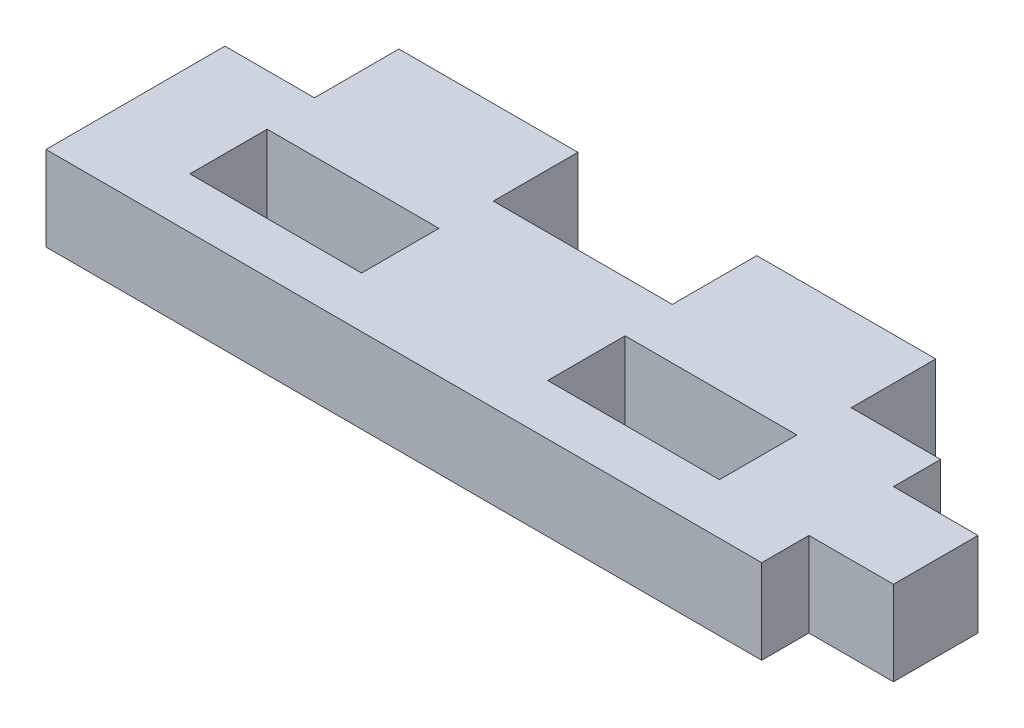
ISO-10303-21;
HEADER;
FILE_DESCRIPTION(('STEP AP214'),'2;1');
FILE_NAME('part.step','',(''),(''),'','','');
FILE_SCHEMA(('AUTOMOTIVE_DESIGN { 1 0 10303 214 1 1 1 1 }'));
ENDSEC;
DATA;
#1=APPLICATION_CONTEXT('core data for automotive mechanical design processes');
#2=APPLICATION_PROTOCOL_DEFINITION('international standard','automotive_design',2000,#1);
#3=PRODUCT_CONTEXT('',#1,'mechanical');
#4=PRODUCT('Part','Part','',(#3));
#5=PRODUCT_RELATED_PRODUCT_CATEGORY('part','',(#4));
#6=PRODUCT_DEFINITION_FORMATION('','',#4);
#7=PRODUCT_DEFINITION_CONTEXT('part definition',#1,'design');
#8=PRODUCT_DEFINITION('design','',#6,#7);
#9=PRODUCT_DEFINITION_SHAPE('','',#8);
#10=(LENGTH_UNIT() NAMED_UNIT(*) SI_UNIT(.MILLI.,.METRE.));
#11=(NAMED_UNIT(*) PLANE_ANGLE_UNIT() SI_UNIT($,.RADIAN.));
#12=(NAMED_UNIT(*) SI_UNIT($,.STERADIAN.) SOLID_ANGLE_UNIT());
#13=UNCERTAINTY_MEASURE_WITH_UNIT(LENGTH_MEASURE(1.E-05),#10,'distance_accuracy_value','');
#14=(GEOMETRIC_REPRESENTATION_CONTEXT(3) GLOBAL_UNCERTAINTY_ASSIGNED_CONTEXT((#13)) GLOBAL_UNIT_ASSIGNED_CONTEXT((#10,
#11,#12)) REPRESENTATION_CONTEXT('',''));
#15=CARTESIAN_POINT('',(0.,0.,0.));
#16=DIRECTION('',(0.,0.,1.));
#17=DIRECTION('',(1.,0.,0.));
#18=AXIS2_PLACEMENT_3D('',#15,#16,#17);
#19=CARTESIAN_POINT('',(0.,1.5,0.));
#20=DIRECTION('',(0.,-1.,0.));
#21=DIRECTION('',(0.,0.,-1.));
#22=AXIS2_PLACEMENT_3D('',#19,#20,#21);
#23=PLANE('',#22);
#24=DIRECTION('',(0.,0.,-1.));
#25=VECTOR('',#24,1.);
#26=CARTESIAN_POINT('',(3.048,1.5,1.372997));
#27=LINE('',#26,#25);
#28=CARTESIAN_POINT('',(3.048,1.5,1.372997));
#29=VERTEX_POINT('',#28);
#30=CARTESIAN_POINT('',(3.048,1.5,-1.372997));
#31=VERTEX_POINT('',#30);
#32=EDGE_CURVE('E257',#29,#31,#27,.T.);
#33=ORIENTED_EDGE('',*,*,#32,.F.);
#34=DIRECTION('',(1.,0.,0.));
#35=VECTOR('',#34,1.);
#36=CARTESIAN_POINT('',(-3.048,1.5,1.372997));
#37=LINE('',#36,#35);
#38=CARTESIAN_POINT('',(-3.048,1.5,1.372997));
#39=VERTEX_POINT('',#38);
#40=EDGE_CURVE('E268',#39,#29,#37,.T.);
#41=ORIENTED_EDGE('',*,*,#40,.F.);
#42=DIRECTION('',(0.,0.,1.));
#43=VECTOR('',#42,1.);
#44=CARTESIAN_POINT('',(-3.048,1.5,1.372997));
#45=LINE('',#44,#43);
#46=CARTESIAN_POINT('',(-3.048,1.5,-1.372997));
#47=VERTEX_POINT('',#46);
#48=EDGE_CURVE('E264',#47,#39,#45,.T.);
#49=ORIENTED_EDGE('',*,*,#48,.F.);
#50=DIRECTION('',(-1.,0.,0.));
#51=VECTOR('',#50,1.);
#52=CARTESIAN_POINT('',(-3.048,1.5,-1.372997));
#53=LINE('',#52,#51);
#54=EDGE_CURVE('E260',#31,#47,#53,.T.);
#55=ORIENTED_EDGE('',*,*,#54,.F.);
#56=EDGE_LOOP('',(#33,#41,#49,#55));
#57=FACE_BOUND('',#56,.T.);
#58=DIRECTION('',(0.,0.,-1.));
#59=VECTOR('',#58,1.);
#60=CARTESIAN_POINT('',(6.35,1.5,-1.5));
#61=LINE('',#60,#59);
#62=CARTESIAN_POINT('',(6.35,1.5,-1.5));
#63=VERTEX_POINT('',#62);
#64=CARTESIAN_POINT('',(6.35,1.5,-3.175));
#65=VERTEX_POINT('',#64);
#66=EDGE_CURVE('E300',#63,#65,#61,.T.);
#67=ORIENTED_EDGE('',*,*,#66,.T.);
#68=DIRECTION('',(-1.,0.,0.));
#69=VECTOR('',#68,1.);
#70=CARTESIAN_POINT('',(3.175,1.5,-3.175));
#71=LINE('',#70,#69);
#72=CARTESIAN_POINT('',(3.175,1.5,-3.175));
#73=VERTEX_POINT('',#72);
#74=EDGE_CURVE('E304',#65,#73,#71,.T.);
#75=ORIENTED_EDGE('',*,*,#74,.T.);
#76=DIRECTION('',(0.,0.,-1.));
#77=VECTOR('',#76,1.);
#78=CARTESIAN_POINT('',(3.175,1.5,-6.175));
#79=LINE('',#78,#77);
#80=CARTESIAN_POINT('',(3.175,1.5,-6.175));
#81=VERTEX_POINT('',#80);
#82=EDGE_CURVE('E308',#73,#81,#79,.T.);
#83=ORIENTED_EDGE('',*,*,#82,.T.);
#84=DIRECTION('',(-1.,0.,0.));
#85=VECTOR('',#84,1.);
#86=CARTESIAN_POINT('',(-3.175,1.5,-6.175));
#87=LINE('',#86,#85);
#88=CARTESIAN_POINT('',(-3.175,1.5,-6.175));
#89=VERTEX_POINT('',#88);
#90=EDGE_CURVE('E311',#81,#89,#87,.T.);
#91=ORIENTED_EDGE('',*,*,#90,.T.);
#92=DIRECTION('',(0.,0.,1.));
#93=VECTOR('',#92,1.);
#94=CARTESIAN_POINT('',(-3.175,1.5,-6.175));
#95=LINE('',#94,#93);
#96=CARTESIAN_POINT('',(-3.175,1.5,-3.175));
#97=VERTEX_POINT('',#96);
#98=EDGE_CURVE('E314',#89,#97,#95,.T.);
#99=ORIENTED_EDGE('',*,*,#98,.T.);
#100=DIRECTION('',(-1.,0.,0.));
#101=VECTOR('',#100,1.);
#102=CARTESIAN_POINT('',(-6.35,1.5,-3.175));
#103=LINE('',#102,#101);
#104=CARTESIAN_POINT('',(-9.525,1.5,-3.175));
#105=VERTEX_POINT('',#104);
#106=EDGE_CURVE('E317',#97,#105,#103,.T.);
#107=ORIENTED_EDGE('',*,*,#106,.T.);
#108=DIRECTION('',(0.,0.,-1.));
#109=VECTOR('',#108,1.);
#110=CARTESIAN_POINT('',(-9.525,1.5,-6.175));
#111=LINE('',#110,#109);
#112=CARTESIAN_POINT('',(-9.525,1.5,-6.175));
#113=VERTEX_POINT('',#112);
#114=EDGE_CURVE('E320',#105,#113,#111,.T.);
#115=ORIENTED_EDGE('',*,*,#114,.T.);
#116=DIRECTION('',(-1.,0.,0.));
#117=VECTOR('',#116,1.);
#118=CARTESIAN_POINT('',(-15.875,1.5,-6.175));
#119=LINE('',#118,#117);
#120=CARTESIAN_POINT('',(-15.875,1.5,-6.175));
#121=VERTEX_POINT('',#120);
#122=EDGE_CURVE('E323',#113,#121,#119,.T.);
#123=ORIENTED_EDGE('',*,*,#122,.T.);
#124=DIRECTION('',(0.,0.,1.));
#125=VECTOR('',#124,1.);
#126=CARTESIAN_POINT('',(-15.875,1.5,-6.175));
#127=LINE('',#126,#125);
#128=CARTESIAN_POINT('',(-15.875,1.5,-3.175));
#129=VERTEX_POINT('',#128);
#130=EDGE_CURVE('E326',#121,#129,#127,.T.);
#131=ORIENTED_EDGE('',*,*,#130,.T.);
#132=DIRECTION('',(-1.,0.,0.));
#133=VECTOR('',#132,1.);
#134=CARTESIAN_POINT('',(-19.05,1.5,-3.175));
#135=LINE('',#134,#133);
#136=CARTESIAN_POINT('',(-19.05,1.5,-3.175));
#137=VERTEX_POINT('',#136);
#138=EDGE_CURVE('E329',#129,#137,#135,.T.);
#139=ORIENTED_EDGE('',*,*,#138,.T.);
#140=DIRECTION('',(0.,0.,1.));
#141=VECTOR('',#140,1.);
#142=CARTESIAN_POINT('',(-19.05,1.5,3.175));
#143=LINE('',#142,#141);
#144=CARTESIAN_POINT('',(-19.05,1.5,3.175));
#145=VERTEX_POINT('',#144);
#146=EDGE_CURVE('E332',#137,#145,#143,.T.);
#147=ORIENTED_EDGE('',*,*,#146,.T.);
#148=DIRECTION('',(1.,0.,0.));
#149=VECTOR('',#148,1.);
#150=CARTESIAN_POINT('',(-19.05,1.5,3.175));
#151=LINE('',#150,#149);
#152=CARTESIAN_POINT('',(6.35,1.5,3.175));
#153=VERTEX_POINT('',#152);
#154=EDGE_CURVE('E335',#145,#153,#151,.T.);
#155=ORIENTED_EDGE('',*,*,#154,.T.);
#156=DIRECTION('',(0.,0.,-1.));
#157=VECTOR('',#156,1.);
#158=CARTESIAN_POINT('',(6.35,1.5,3.175));
#159=LINE('',#158,#157);
#160=CARTESIAN_POINT('',(6.35,1.5,1.5));
#161=VERTEX_POINT('',#160);
#162=EDGE_CURVE('E338',#153,#161,#159,.T.);
#163=ORIENTED_EDGE('',*,*,#162,.T.);
#164=DIRECTION('',(1.,0.,0.));
#165=VECTOR('',#164,1.);
#166=CARTESIAN_POINT('',(9.35,1.5,1.5));
#167=LINE('',#166,#165);
#168=CARTESIAN_POINT('',(9.35,1.5,1.5));
#169=VERTEX_POINT('',#168);
#170=EDGE_CURVE('E341',#161,#169,#167,.T.);
#171=ORIENTED_EDGE('',*,*,#170,.T.);
#172=DIRECTION('',(0.,0.,-1.));
#173=VECTOR('',#172,1.);
#174=CARTESIAN_POINT('',(9.35,1.5,1.5));
#175=LINE('',#174,#173);
#176=CARTESIAN_POINT('',(9.35,1.5,-1.5));
#177=VERTEX_POINT('',#176);
#178=EDGE_CURVE('E344',#169,#177,#175,.T.);
#179=ORIENTED_EDGE('',*,*,#178,.T.);
#180=DIRECTION('',(-1.,0.,0.));
#181=VECTOR('',#180,1.);
#182=CARTESIAN_POINT('',(9.35,1.5,-1.5));
#183=LINE('',#182,#181);
#184=EDGE_CURVE('E347',#177,#63,#183,.T.);
#185=ORIENTED_EDGE('',*,*,#184,.T.);
#186=EDGE_LOOP('',(#67,#75,#83,#91,#99,#107,#115,#123,#131,#139,#147,#155,#163,#171,#179,#185));
#187=FACE_BOUND('',#186,.T.);
#188=DIRECTION('',(0.,0.,-1.));
#189=VECTOR('',#188,1.);
#190=CARTESIAN_POINT('',(-9.652,1.5,-1.372997));
#191=LINE('',#190,#189);
#192=CARTESIAN_POINT('',(-9.652,1.5,1.372997));
#193=VERTEX_POINT('',#192);
#194=CARTESIAN_POINT('',(-9.652,1.5,-1.372997));
#195=VERTEX_POINT('',#194);
#196=EDGE_CURVE('E209',#193,#195,#191,.T.);
#197=ORIENTED_EDGE('',*,*,#196,.F.);
#198=DIRECTION('',(1.,0.,0.));
#199=VECTOR('',#198,1.);
#200=CARTESIAN_POINT('',(-15.748,1.5,1.372997));
#201=LINE('',#200,#199);
#202=CARTESIAN_POINT('',(-15.748,1.5,1.372997));
#203=VERTEX_POINT('',#202);
#204=EDGE_CURVE('E235',#203,#193,#201,.T.);
#205=ORIENTED_EDGE('',*,*,#204,.F.);
#206=DIRECTION('',(0.,0.,1.));
#207=VECTOR('',#206,1.);
#208=CARTESIAN_POINT('',(-15.748,1.5,-1.372997));
#209=LINE('',#208,#207);
#210=CARTESIAN_POINT('',(-15.748,1.5,-1.372997));
#211=VERTEX_POINT('',#210);
#212=EDGE_CURVE('E231',#211,#203,#209,.T.);
#213=ORIENTED_EDGE('',*,*,#212,.F.);
#214=DIRECTION('',(-1.,0.,0.));
#215=VECTOR('',#214,1.);
#216=CARTESIAN_POINT('',(-15.748,1.5,-1.372997));
#217=LINE('',#216,#215);
#218=EDGE_CURVE('E218',#195,#211,#217,.T.);
#219=ORIENTED_EDGE('',*,*,#218,.F.);
#220=EDGE_LOOP('',(#197,#205,#213,#219));
#221=FACE_BOUND('',#220,.T.);
#222=ADVANCED_FACE('F47',(#57,#187,#221),#23,.F.);
#223=CARTESIAN_POINT('',(0.,-1.5,0.));
#224=DIRECTION('',(0.,-1.,0.));
#225=DIRECTION('',(0.,0.,-1.));
#226=AXIS2_PLACEMENT_3D('',#223,#224,#225);
#227=PLANE('',#226);
#228=DIRECTION('',(0.,0.,-1.));
#229=VECTOR('',#228,1.);
#230=CARTESIAN_POINT('',(6.35,-1.5,-1.5));
#231=LINE('',#230,#229);
#232=CARTESIAN_POINT('',(6.35,-1.5,-1.5));
#233=VERTEX_POINT('',#232);
#234=CARTESIAN_POINT('',(6.35,-1.5,-3.175));
#235=VERTEX_POINT('',#234);
#236=EDGE_CURVE('E299',#233,#235,#231,.T.);
#237=ORIENTED_EDGE('',*,*,#236,.F.);
#238=DIRECTION('',(-1.,0.,0.));
#239=VECTOR('',#238,1.);
#240=CARTESIAN_POINT('',(9.35,-1.5,-1.5));
#241=LINE('',#240,#239);
#242=CARTESIAN_POINT('',(9.35,-1.5,-1.5));
#243=VERTEX_POINT('',#242);
#244=EDGE_CURVE('E305',#243,#233,#241,.T.);
#245=ORIENTED_EDGE('',*,*,#244,.F.);
#246=DIRECTION('',(0.,0.,-1.));
#247=VECTOR('',#246,1.);
#248=CARTESIAN_POINT('',(9.35,-1.5,1.5));
#249=LINE('',#248,#247);
#250=CARTESIAN_POINT('',(9.35,-1.5,1.5));
#251=VERTEX_POINT('',#250);
#252=EDGE_CURVE('E395',#251,#243,#249,.T.);
#253=ORIENTED_EDGE('',*,*,#252,.F.);
#254=DIRECTION('',(1.,0.,0.));
#255=VECTOR('',#254,1.);
#256=CARTESIAN_POINT('',(9.35,-1.5,1.5));
#257=LINE('',#256,#255);
#258=CARTESIAN_POINT('',(6.35,-1.5,1.5));
#259=VERTEX_POINT('',#258);
#260=EDGE_CURVE('E392',#259,#251,#257,.T.);
#261=ORIENTED_EDGE('',*,*,#260,.F.);
#262=DIRECTION('',(0.,0.,-1.));
#263=VECTOR('',#262,1.);
#264=CARTESIAN_POINT('',(6.35,-1.5,3.175));
#265=LINE('',#264,#263);
#266=CARTESIAN_POINT('',(6.35,-1.5,3.175));
#267=VERTEX_POINT('',#266);
#268=EDGE_CURVE('E389',#267,#259,#265,.T.);
#269=ORIENTED_EDGE('',*,*,#268,.F.);
#270=DIRECTION('',(1.,0.,0.));
#271=VECTOR('',#270,1.);
#272=CARTESIAN_POINT('',(-6.35,-1.5,3.175));
#273=LINE('',#272,#271);
#274=CARTESIAN_POINT('',(-19.05,-1.5,3.175));
#275=VERTEX_POINT('',#274);
#276=EDGE_CURVE('E386',#275,#267,#273,.T.);
#277=ORIENTED_EDGE('',*,*,#276,.F.);
#278=DIRECTION('',(0.,0.,1.));
#279=VECTOR('',#278,1.);
#280=CARTESIAN_POINT('',(-19.05,-1.5,3.175));
#281=LINE('',#280,#279);
#282=CARTESIAN_POINT('',(-19.05,-1.5,-3.175));
#283=VERTEX_POINT('',#282);
#284=EDGE_CURVE('E382',#283,#275,#281,.T.);
#285=ORIENTED_EDGE('',*,*,#284,.F.);
#286=DIRECTION('',(-1.,0.,0.));
#287=VECTOR('',#286,1.);
#288=CARTESIAN_POINT('',(-19.05,-1.5,-3.175));
#289=LINE('',#288,#287);
#290=CARTESIAN_POINT('',(-15.875,-1.5,-3.175));
#291=VERTEX_POINT('',#290);
#292=EDGE_CURVE('E379',#291,#283,#289,.T.);
#293=ORIENTED_EDGE('',*,*,#292,.F.);
#294=DIRECTION('',(0.,0.,1.));
#295=VECTOR('',#294,1.);
#296=CARTESIAN_POINT('',(-15.875,-1.5,-6.175));
#297=LINE('',#296,#295);
#298=CARTESIAN_POINT('',(-15.875,-1.5,-6.175));
#299=VERTEX_POINT('',#298);
#300=EDGE_CURVE('E376',#299,#291,#297,.T.);
#301=ORIENTED_EDGE('',*,*,#300,.F.);
#302=DIRECTION('',(-1.,0.,0.));
#303=VECTOR('',#302,1.);
#304=CARTESIAN_POINT('',(-15.875,-1.5,-6.175));
#305=LINE('',#304,#303);
#306=CARTESIAN_POINT('',(-9.525,-1.5,-6.175));
#307=VERTEX_POINT('',#306);
#308=EDGE_CURVE('E373',#307,#299,#305,.T.);
#309=ORIENTED_EDGE('',*,*,#308,.F.);
#310=DIRECTION('',(0.,0.,-1.));
#311=VECTOR('',#310,1.);
#312=CARTESIAN_POINT('',(-9.525,-1.5,-6.175));
#313=LINE('',#312,#311);
#314=CARTESIAN_POINT('',(-9.525,-1.5,-3.175));
#315=VERTEX_POINT('',#314);
#316=EDGE_CURVE('E370',#315,#307,#313,.T.);
#317=ORIENTED_EDGE('',*,*,#316,.F.);
#318=DIRECTION('',(-1.,0.,0.));
#319=VECTOR('',#318,1.);
#320=CARTESIAN_POINT('',(-9.525,-1.5,-3.175));
#321=LINE('',#320,#319);
#322=CARTESIAN_POINT('',(-3.175,-1.5,-3.175));
#323=VERTEX_POINT('',#322);
#324=EDGE_CURVE('E367',#323,#315,#321,.T.);
#325=ORIENTED_EDGE('',*,*,#324,.F.);
#326=DIRECTION('',(0.,0.,1.));
#327=VECTOR('',#326,1.);
#328=CARTESIAN_POINT('',(-3.175,-1.5,-6.175));
#329=LINE('',#328,#327);
#330=CARTESIAN_POINT('',(-3.175,-1.5,-6.175));
#331=VERTEX_POINT('',#330);
#332=EDGE_CURVE('E363',#331,#323,#329,.T.);
#333=ORIENTED_EDGE('',*,*,#332,.F.);
#334=DIRECTION('',(-1.,0.,0.));
#335=VECTOR('',#334,1.);
#336=CARTESIAN_POINT('',(-3.175,-1.5,-6.175));
#337=LINE('',#336,#335);
#338=CARTESIAN_POINT('',(3.175,-1.5,-6.175));
#339=VERTEX_POINT('',#338);
#340=EDGE_CURVE('E360',#339,#331,#337,.T.);
#341=ORIENTED_EDGE('',*,*,#340,.F.);
#342=DIRECTION('',(0.,0.,-1.));
#343=VECTOR('',#342,1.);
#344=CARTESIAN_POINT('',(3.175,-1.5,-6.175));
#345=LINE('',#344,#343);
#346=CARTESIAN_POINT('',(3.175,-1.5,-3.175));
#347=VERTEX_POINT('',#346);
#348=EDGE_CURVE('E357',#347,#339,#345,.T.);
#349=ORIENTED_EDGE('',*,*,#348,.F.);
#350=DIRECTION('',(-1.,0.,0.));
#351=VECTOR('',#350,1.);
#352=CARTESIAN_POINT('',(3.175,-1.5,-3.175));
#353=LINE('',#352,#351);
#354=EDGE_CURVE('E354',#235,#347,#353,.T.);
#355=ORIENTED_EDGE('',*,*,#354,.F.);
#356=EDGE_LOOP('',(#237,#245,#253,#261,#269,#277,#285,#293,#301,#309,#317,#325,#333,#341,#349,#355));
#357=FACE_BOUND('',#356,.T.);
#358=DIRECTION('',(1.,0.,0.));
#359=VECTOR('',#358,1.);
#360=CARTESIAN_POINT('',(-3.048,-1.5,1.372997));
#361=LINE('',#360,#359);
#362=CARTESIAN_POINT('',(-3.048,-1.5,1.372997));
#363=VERTEX_POINT('',#362);
#364=CARTESIAN_POINT('',(3.048,-1.5,1.372997));
#365=VERTEX_POINT('',#364);
#366=EDGE_CURVE('E261',#363,#365,#361,.T.);
#367=ORIENTED_EDGE('',*,*,#366,.T.);
#368=DIRECTION('',(0.,0.,-1.));
#369=VECTOR('',#368,1.);
#370=CARTESIAN_POINT('',(3.048,-1.5,1.372997));
#371=LINE('',#370,#369);
#372=CARTESIAN_POINT('',(3.048,-1.5,-1.372997));
#373=VERTEX_POINT('',#372);
#374=EDGE_CURVE('E227',#365,#373,#371,.T.);
#375=ORIENTED_EDGE('',*,*,#374,.T.);
#376=DIRECTION('',(-1.,0.,0.));
#377=VECTOR('',#376,1.);
#378=CARTESIAN_POINT('',(-3.048,-1.5,-1.372997));
#379=LINE('',#378,#377);
#380=CARTESIAN_POINT('',(-3.048,-1.5,-1.372997));
#381=VERTEX_POINT('',#380);
#382=EDGE_CURVE('E275',#373,#381,#379,.T.);
#383=ORIENTED_EDGE('',*,*,#382,.T.);
#384=DIRECTION('',(0.,0.,1.));
#385=VECTOR('',#384,1.);
#386=CARTESIAN_POINT('',(-3.048,-1.5,1.372997));
#387=LINE('',#386,#385);
#388=EDGE_CURVE('E279',#381,#363,#387,.T.);
#389=ORIENTED_EDGE('',*,*,#388,.T.);
#390=EDGE_LOOP('',(#367,#375,#383,#389));
#391=FACE_BOUND('',#390,.T.);
#392=DIRECTION('',(1.,0.,0.));
#393=VECTOR('',#392,1.);
#394=CARTESIAN_POINT('',(-15.748,-1.5,1.372997));
#395=LINE('',#394,#393);
#396=CARTESIAN_POINT('',(-15.748,-1.5,1.372997));
#397=VERTEX_POINT('',#396);
#398=CARTESIAN_POINT('',(-9.652,-1.5,1.372997));
#399=VERTEX_POINT('',#398);
#400=EDGE_CURVE('E219',#397,#399,#395,.T.);
#401=ORIENTED_EDGE('',*,*,#400,.T.);
#402=DIRECTION('',(0.,0.,-1.));
#403=VECTOR('',#402,1.);
#404=CARTESIAN_POINT('',(-9.652,-1.5,-1.372997));
#405=LINE('',#404,#403);
#406=CARTESIAN_POINT('',(-9.652,-1.5,-1.372997));
#407=VERTEX_POINT('',#406);
#408=EDGE_CURVE('E71',#399,#407,#405,.T.);
#409=ORIENTED_EDGE('',*,*,#408,.T.);
#410=DIRECTION('',(-1.,0.,0.));
#411=VECTOR('',#410,1.);
#412=CARTESIAN_POINT('',(-15.748,-1.5,-1.372997));
#413=LINE('',#412,#411);
#414=CARTESIAN_POINT('',(-15.748,-1.5,-1.372997));
#415=VERTEX_POINT('',#414);
#416=EDGE_CURVE('E225',#407,#415,#413,.T.);
#417=ORIENTED_EDGE('',*,*,#416,.T.);
#418=DIRECTION('',(0.,0.,1.));
#419=VECTOR('',#418,1.);
#420=CARTESIAN_POINT('',(-15.748,-1.5,-1.372997));
#421=LINE('',#420,#419);
#422=EDGE_CURVE('E244',#415,#397,#421,.T.);
#423=ORIENTED_EDGE('',*,*,#422,.T.);
#424=EDGE_LOOP('',(#401,#409,#417,#423));
#425=FACE_BOUND('',#424,.T.);
#426=ADVANCED_FACE('F466',(#357,#391,#425),#227,.T.);
#427=CARTESIAN_POINT('',(6.35,1.5,-1.5));
#428=DIRECTION('',(-1.,0.,0.));
#429=DIRECTION('',(0.,0.,1.));
#430=AXIS2_PLACEMENT_3D('',#427,#428,#429);
#431=PLANE('',#430);
#432=ORIENTED_EDGE('',*,*,#236,.T.);
#433=DIRECTION('',(0.,-1.,0.));
#434=VECTOR('',#433,1.);
#435=CARTESIAN_POINT('',(6.35,1.5,-3.175));
#436=LINE('',#435,#434);
#437=EDGE_CURVE('E11',#65,#235,#436,.T.);
#438=ORIENTED_EDGE('',*,*,#437,.F.);
#439=ORIENTED_EDGE('',*,*,#66,.F.);
#440=DIRECTION('',(0.,-1.,0.));
#441=VECTOR('',#440,1.);
#442=CARTESIAN_POINT('',(6.35,1.5,-1.5));
#443=LINE('',#442,#441);
#444=EDGE_CURVE('E350',#63,#233,#443,.T.);
#445=ORIENTED_EDGE('',*,*,#444,.T.);
#446=EDGE_LOOP('',(#432,#438,#439,#445));
#447=FACE_BOUND('',#446,.T.);
#448=ADVANCED_FACE('F49',(#447),#431,.F.);
#449=CARTESIAN_POINT('',(3.175,1.5,-3.175));
#450=DIRECTION('',(0.,0.,1.));
#451=DIRECTION('',(1.,0.,0.));
#452=AXIS2_PLACEMENT_3D('',#449,#450,#451);
#453=PLANE('',#452);
#454=ORIENTED_EDGE('',*,*,#354,.T.);
#455=DIRECTION('',(0.,-1.,0.));
#456=VECTOR('',#455,1.);
#457=CARTESIAN_POINT('',(3.175,1.5,-3.175));
#458=LINE('',#457,#456);
#459=EDGE_CURVE('E56',#73,#347,#458,.T.);
#460=ORIENTED_EDGE('',*,*,#459,.F.);
#461=ORIENTED_EDGE('',*,*,#74,.F.);
#462=ORIENTED_EDGE('',*,*,#437,.T.);
#463=EDGE_LOOP('',(#454,#460,#461,#462));
#464=FACE_BOUND('',#463,.T.);
#465=ADVANCED_FACE('F482',(#464),#453,.F.);
#466=CARTESIAN_POINT('',(3.175,1.5,-6.175));
#467=DIRECTION('',(-1.,0.,0.));
#468=DIRECTION('',(0.,0.,1.));
#469=AXIS2_PLACEMENT_3D('',#466,#467,#468);
#470=PLANE('',#469);
#471=ORIENTED_EDGE('',*,*,#348,.T.);
#472=DIRECTION('',(0.,-1.,0.));
#473=VECTOR('',#472,1.);
#474=CARTESIAN_POINT('',(3.175,1.5,-6.175));
#475=LINE('',#474,#473);
#476=EDGE_CURVE('E451',#81,#339,#475,.T.);
#477=ORIENTED_EDGE('',*,*,#476,.F.);
#478=ORIENTED_EDGE('',*,*,#82,.F.);
#479=ORIENTED_EDGE('',*,*,#459,.T.);
#480=EDGE_LOOP('',(#471,#477,#478,#479));
#481=FACE_BOUND('',#480,.T.);
#482=ADVANCED_FACE('F460',(#481),#470,.F.);
#483=CARTESIAN_POINT('',(-3.175,1.5,-6.175));
#484=DIRECTION('',(0.,0.,1.));
#485=DIRECTION('',(1.,0.,0.));
#486=AXIS2_PLACEMENT_3D('',#483,#484,#485);
#487=PLANE('',#486);
#488=ORIENTED_EDGE('',*,*,#340,.T.);
#489=DIRECTION('',(0.,-1.,0.));
#490=VECTOR('',#489,1.);
#491=CARTESIAN_POINT('',(-3.175,1.5,-6.175));
#492=LINE('',#491,#490);
#493=EDGE_CURVE('E447',#89,#331,#492,.T.);
#494=ORIENTED_EDGE('',*,*,#493,.F.);
#495=ORIENTED_EDGE('',*,*,#90,.F.);
#496=ORIENTED_EDGE('',*,*,#476,.T.);
#497=EDGE_LOOP('',(#488,#494,#495,#496));
#498=FACE_BOUND('',#497,.T.);
#499=ADVANCED_FACE('F471',(#498),#487,.F.);
#500=CARTESIAN_POINT('',(-3.175,1.5,-6.175));
#501=DIRECTION('',(1.,0.,0.));
#502=DIRECTION('',(0.,0.,-1.));
#503=AXIS2_PLACEMENT_3D('',#500,#501,#502);
#504=PLANE('',#503);
#505=ORIENTED_EDGE('',*,*,#332,.T.);
#506=DIRECTION('',(0.,-1.,0.));
#507=VECTOR('',#506,1.);
#508=CARTESIAN_POINT('',(-3.175,1.5,-3.175));
#509=LINE('',#508,#507);
#510=EDGE_CURVE('E443',#97,#323,#509,.T.);
#511=ORIENTED_EDGE('',*,*,#510,.F.);
#512=ORIENTED_EDGE('',*,*,#98,.F.);
#513=ORIENTED_EDGE('',*,*,#493,.T.);
#514=EDGE_LOOP('',(#505,#511,#512,#513));
#515=FACE_BOUND('',#514,.T.);
#516=ADVANCED_FACE('F475',(#515),#504,.F.);
#517=CARTESIAN_POINT('',(-9.525,1.5,-3.175));
#518=DIRECTION('',(0.,0.,1.));
#519=DIRECTION('',(1.,0.,0.));
#520=AXIS2_PLACEMENT_3D('',#517,#518,#519);
#521=PLANE('',#520);
#522=ORIENTED_EDGE('',*,*,#324,.T.);
#523=DIRECTION('',(0.,-1.,0.));
#524=VECTOR('',#523,1.);
#525=CARTESIAN_POINT('',(-9.525,1.5,-3.175));
#526=LINE('',#525,#524);
#527=EDGE_CURVE('E439',#105,#315,#526,.T.);
#528=ORIENTED_EDGE('',*,*,#527,.F.);
#529=ORIENTED_EDGE('',*,*,#106,.F.);
#530=ORIENTED_EDGE('',*,*,#510,.T.);
#531=EDGE_LOOP('',(#522,#528,#529,#530));
#532=FACE_BOUND('',#531,.T.);
#533=ADVANCED_FACE('F534',(#532),#521,.F.);
#534=CARTESIAN_POINT('',(-9.525,1.5,-6.175));
#535=DIRECTION('',(-1.,0.,0.));
#536=DIRECTION('',(0.,0.,1.));
#537=AXIS2_PLACEMENT_3D('',#534,#535,#536);
#538=PLANE('',#537);
#539=ORIENTED_EDGE('',*,*,#316,.T.);
#540=DIRECTION('',(0.,-1.,0.));
#541=VECTOR('',#540,1.);
#542=CARTESIAN_POINT('',(-9.525,1.5,-6.175));
#543=LINE('',#542,#541);
#544=EDGE_CURVE('E435',#113,#307,#543,.T.);
#545=ORIENTED_EDGE('',*,*,#544,.F.);
#546=ORIENTED_EDGE('',*,*,#114,.F.);
#547=ORIENTED_EDGE('',*,*,#527,.T.);
#548=EDGE_LOOP('',(#539,#545,#546,#547));
#549=FACE_BOUND('',#548,.T.);
#550=ADVANCED_FACE('F531',(#549),#538,.F.);
#551=CARTESIAN_POINT('',(-15.875,1.5,-6.175));
#552=DIRECTION('',(0.,0.,1.));
#553=DIRECTION('',(1.,0.,0.));
#554=AXIS2_PLACEMENT_3D('',#551,#552,#553);
#555=PLANE('',#554);
#556=ORIENTED_EDGE('',*,*,#308,.T.);
#557=DIRECTION('',(0.,-1.,0.));
#558=VECTOR('',#557,1.);
#559=CARTESIAN_POINT('',(-15.875,1.5,-6.175));
#560=LINE('',#559,#558);
#561=EDGE_CURVE('E431',#121,#299,#560,.T.);
#562=ORIENTED_EDGE('',*,*,#561,.F.);
#563=ORIENTED_EDGE('',*,*,#122,.F.);
#564=ORIENTED_EDGE('',*,*,#544,.T.);
#565=EDGE_LOOP('',(#556,#562,#563,#564));
#566=FACE_BOUND('',#565,.T.);
#567=ADVANCED_FACE('F527',(#566),#555,.F.);
#568=CARTESIAN_POINT('',(-15.875,1.5,-6.175));
#569=DIRECTION('',(1.,0.,0.));
#570=DIRECTION('',(0.,0.,-1.));
#571=AXIS2_PLACEMENT_3D('',#568,#569,#570);
#572=PLANE('',#571);
#573=ORIENTED_EDGE('',*,*,#300,.T.);
#574=DIRECTION('',(0.,-1.,0.));
#575=VECTOR('',#574,1.);
#576=CARTESIAN_POINT('',(-15.875,1.5,-3.175));
#577=LINE('',#576,#575);
#578=EDGE_CURVE('E427',#129,#291,#577,.T.);
#579=ORIENTED_EDGE('',*,*,#578,.F.);
#580=ORIENTED_EDGE('',*,*,#130,.F.);
#581=ORIENTED_EDGE('',*,*,#561,.T.);
#582=EDGE_LOOP('',(#573,#579,#580,#581));
#583=FACE_BOUND('',#582,.T.);
#584=ADVANCED_FACE('F523',(#583),#572,.F.);
#585=CARTESIAN_POINT('',(-19.05,1.5,-3.175));
#586=DIRECTION('',(0.,0.,1.));
#587=DIRECTION('',(1.,0.,0.));
#588=AXIS2_PLACEMENT_3D('',#585,#586,#587);
#589=PLANE('',#588);
#590=ORIENTED_EDGE('',*,*,#292,.T.);
#591=DIRECTION('',(0.,-1.,0.));
#592=VECTOR('',#591,1.);
#593=CARTESIAN_POINT('',(-19.05,1.5,-3.175));
#594=LINE('',#593,#592);
#595=EDGE_CURVE('E423',#137,#283,#594,.T.);
#596=ORIENTED_EDGE('',*,*,#595,.F.);
#597=ORIENTED_EDGE('',*,*,#138,.F.);
#598=ORIENTED_EDGE('',*,*,#578,.T.);
#599=EDGE_LOOP('',(#590,#596,#597,#598));
#600=FACE_BOUND('',#599,.T.);
#601=ADVANCED_FACE('F518',(#600),#589,.F.);
#602=CARTESIAN_POINT('',(-19.05,1.5,3.175));
#603=DIRECTION('',(1.,0.,0.));
#604=DIRECTION('',(0.,0.,-1.));
#605=AXIS2_PLACEMENT_3D('',#602,#603,#604);
#606=PLANE('',#605);
#607=ORIENTED_EDGE('',*,*,#284,.T.);
#608=DIRECTION('',(0.,-1.,0.));
#609=VECTOR('',#608,1.);
#610=CARTESIAN_POINT('',(-19.05,1.5,3.175));
#611=LINE('',#610,#609);
#612=EDGE_CURVE('E419',#145,#275,#611,.T.);
#613=ORIENTED_EDGE('',*,*,#612,.F.);
#614=ORIENTED_EDGE('',*,*,#146,.F.);
#615=ORIENTED_EDGE('',*,*,#595,.T.);
#616=EDGE_LOOP('',(#607,#613,#614,#615));
#617=FACE_BOUND('',#616,.T.);
#618=ADVANCED_FACE('F512',(#617),#606,.F.);
#619=CARTESIAN_POINT('',(-6.35,1.5,3.175));
#620=DIRECTION('',(0.,0.,-1.));
#621=DIRECTION('',(-1.,0.,0.));
#622=AXIS2_PLACEMENT_3D('',#619,#620,#621);
#623=PLANE('',#622);
#624=ORIENTED_EDGE('',*,*,#276,.T.);
#625=DIRECTION('',(0.,-1.,0.));
#626=VECTOR('',#625,1.);
#627=CARTESIAN_POINT('',(6.35,1.5,3.175));
#628=LINE('',#627,#626);
#629=EDGE_CURVE('E415',#153,#267,#628,.T.);
#630=ORIENTED_EDGE('',*,*,#629,.F.);
#631=ORIENTED_EDGE('',*,*,#154,.F.);
#632=ORIENTED_EDGE('',*,*,#612,.T.);
#633=EDGE_LOOP('',(#624,#630,#631,#632));
#634=FACE_BOUND('',#633,.T.);
#635=ADVANCED_FACE('F508',(#634),#623,.F.);
#636=CARTESIAN_POINT('',(6.35,1.5,3.175));
#637=DIRECTION('',(-1.,0.,0.));
#638=DIRECTION('',(0.,0.,1.));
#639=AXIS2_PLACEMENT_3D('',#636,#637,#638);
#640=PLANE('',#639);
#641=ORIENTED_EDGE('',*,*,#268,.T.);
#642=DIRECTION('',(0.,-1.,0.));
#643=VECTOR('',#642,1.);
#644=CARTESIAN_POINT('',(6.35,1.5,1.5));
#645=LINE('',#644,#643);
#646=EDGE_CURVE('E411',#161,#259,#645,.T.);
#647=ORIENTED_EDGE('',*,*,#646,.F.);
#648=ORIENTED_EDGE('',*,*,#162,.F.);
#649=ORIENTED_EDGE('',*,*,#629,.T.);
#650=EDGE_LOOP('',(#641,#647,#648,#649));
#651=FACE_BOUND('',#650,.T.);
#652=ADVANCED_FACE('F503',(#651),#640,.F.);
#653=CARTESIAN_POINT('',(9.35,1.5,1.5));
#654=DIRECTION('',(0.,0.,-1.));
#655=DIRECTION('',(-1.,0.,0.));
#656=AXIS2_PLACEMENT_3D('',#653,#654,#655);
#657=PLANE('',#656);
#658=ORIENTED_EDGE('',*,*,#260,.T.);
#659=DIRECTION('',(0.,-1.,0.));
#660=VECTOR('',#659,1.);
#661=CARTESIAN_POINT('',(9.35,1.5,1.5));
#662=LINE('',#661,#660);
#663=EDGE_CURVE('E407',#169,#251,#662,.T.);
#664=ORIENTED_EDGE('',*,*,#663,.F.);
#665=ORIENTED_EDGE('',*,*,#170,.F.);
#666=ORIENTED_EDGE('',*,*,#646,.T.);
#667=EDGE_LOOP('',(#658,#664,#665,#666));
#668=FACE_BOUND('',#667,.T.);
#669=ADVANCED_FACE('F498',(#668),#657,.F.);
#670=CARTESIAN_POINT('',(9.35,1.5,1.5));
#671=DIRECTION('',(-1.,0.,0.));
#672=DIRECTION('',(0.,0.,1.));
#673=AXIS2_PLACEMENT_3D('',#670,#671,#672);
#674=PLANE('',#673);
#675=ORIENTED_EDGE('',*,*,#252,.T.);
#676=DIRECTION('',(0.,-1.,0.));
#677=VECTOR('',#676,1.);
#678=CARTESIAN_POINT('',(9.35,1.5,-1.5));
#679=LINE('',#678,#677);
#680=EDGE_CURVE('E403',#177,#243,#679,.T.);
#681=ORIENTED_EDGE('',*,*,#680,.F.);
#682=ORIENTED_EDGE('',*,*,#178,.F.);
#683=ORIENTED_EDGE('',*,*,#663,.T.);
#684=EDGE_LOOP('',(#675,#681,#682,#683));
#685=FACE_BOUND('',#684,.T.);
#686=ADVANCED_FACE('F494',(#685),#674,.F.);
#687=CARTESIAN_POINT('',(9.35,1.5,-1.5));
#688=DIRECTION('',(0.,0.,1.));
#689=DIRECTION('',(1.,0.,0.));
#690=AXIS2_PLACEMENT_3D('',#687,#688,#689);
#691=PLANE('',#690);
#692=ORIENTED_EDGE('',*,*,#244,.T.);
#693=ORIENTED_EDGE('',*,*,#444,.F.);
#694=ORIENTED_EDGE('',*,*,#184,.F.);
#695=ORIENTED_EDGE('',*,*,#680,.T.);
#696=EDGE_LOOP('',(#692,#693,#694,#695));
#697=FACE_BOUND('',#696,.T.);
#698=ADVANCED_FACE('F489',(#697),#691,.F.);
#699=CARTESIAN_POINT('',(3.048,1.5,1.372997));
#700=DIRECTION('',(-1.,0.,0.));
#701=DIRECTION('',(0.,0.,1.));
#702=AXIS2_PLACEMENT_3D('',#699,#700,#701);
#703=PLANE('',#702);
#704=ORIENTED_EDGE('',*,*,#374,.F.);
#705=DIRECTION('',(0.,-1.,0.));
#706=VECTOR('',#705,1.);
#707=CARTESIAN_POINT('',(3.048,1.5,1.372997));
#708=LINE('',#707,#706);
#709=EDGE_CURVE('E271',#29,#365,#708,.T.);
#710=ORIENTED_EDGE('',*,*,#709,.F.);
#711=ORIENTED_EDGE('',*,*,#32,.T.);
#712=DIRECTION('',(0.,-1.,0.));
#713=VECTOR('',#712,1.);
#714=CARTESIAN_POINT('',(3.048,1.5,-1.372997));
#715=LINE('',#714,#713);
#716=EDGE_CURVE('E295',#31,#373,#715,.T.);
#717=ORIENTED_EDGE('',*,*,#716,.T.);
#718=EDGE_LOOP('',(#704,#710,#711,#717));
#719=FACE_BOUND('',#718,.T.);
#720=ADVANCED_FACE('F553',(#719),#703,.T.);
#721=CARTESIAN_POINT('',(-3.048,1.5,-1.372997));
#722=DIRECTION('',(0.,0.,1.));
#723=DIRECTION('',(1.,0.,0.));
#724=AXIS2_PLACEMENT_3D('',#721,#722,#723);
#725=PLANE('',#724);
#726=ORIENTED_EDGE('',*,*,#382,.F.);
#727=ORIENTED_EDGE('',*,*,#716,.F.);
#728=ORIENTED_EDGE('',*,*,#54,.T.);
#729=DIRECTION('',(0.,-1.,0.));
#730=VECTOR('',#729,1.);
#731=CARTESIAN_POINT('',(-3.048,1.5,-1.372997));
#732=LINE('',#731,#730);
#733=EDGE_CURVE('E292',#47,#381,#732,.T.);
#734=ORIENTED_EDGE('',*,*,#733,.T.);
#735=EDGE_LOOP('',(#726,#727,#728,#734));
#736=FACE_BOUND('',#735,.T.);
#737=ADVANCED_FACE('F636',(#736),#725,.T.);
#738=CARTESIAN_POINT('',(-3.048,1.5,1.372997));
#739=DIRECTION('',(1.,0.,0.));
#740=DIRECTION('',(0.,0.,-1.));
#741=AXIS2_PLACEMENT_3D('',#738,#739,#740);
#742=PLANE('',#741);
#743=ORIENTED_EDGE('',*,*,#388,.F.);
#744=ORIENTED_EDGE('',*,*,#733,.F.);
#745=ORIENTED_EDGE('',*,*,#48,.T.);
#746=DIRECTION('',(0.,-1.,0.));
#747=VECTOR('',#746,1.);
#748=CARTESIAN_POINT('',(-3.048,1.5,1.372997));
#749=LINE('',#748,#747);
#750=EDGE_CURVE('E289',#39,#363,#749,.T.);
#751=ORIENTED_EDGE('',*,*,#750,.T.);
#752=EDGE_LOOP('',(#743,#744,#745,#751));
#753=FACE_BOUND('',#752,.T.);
#754=ADVANCED_FACE('F647',(#753),#742,.T.);
#755=CARTESIAN_POINT('',(-3.048,1.5,1.372997));
#756=DIRECTION('',(0.,0.,-1.));
#757=DIRECTION('',(-1.,0.,0.));
#758=AXIS2_PLACEMENT_3D('',#755,#756,#757);
#759=PLANE('',#758);
#760=ORIENTED_EDGE('',*,*,#366,.F.);
#761=ORIENTED_EDGE('',*,*,#750,.F.);
#762=ORIENTED_EDGE('',*,*,#40,.T.);
#763=ORIENTED_EDGE('',*,*,#709,.T.);
#764=EDGE_LOOP('',(#760,#761,#762,#763));
#765=FACE_BOUND('',#764,.T.);
#766=ADVANCED_FACE('F657',(#765),#759,.T.);
#767=CARTESIAN_POINT('',(-9.652,1.5,-1.372997));
#768=DIRECTION('',(-1.,0.,0.));
#769=DIRECTION('',(0.,0.,1.));
#770=AXIS2_PLACEMENT_3D('',#767,#768,#769);
#771=PLANE('',#770);
#772=ORIENTED_EDGE('',*,*,#408,.F.);
#773=DIRECTION('',(0.,-1.,0.));
#774=VECTOR('',#773,1.);
#775=CARTESIAN_POINT('',(-9.652,1.5,1.372997));
#776=LINE('',#775,#774);
#777=EDGE_CURVE('E213',#193,#399,#776,.T.);
#778=ORIENTED_EDGE('',*,*,#777,.F.);
#779=ORIENTED_EDGE('',*,*,#196,.T.);
#780=DIRECTION('',(0.,-1.,0.));
#781=VECTOR('',#780,1.);
#782=CARTESIAN_POINT('',(-9.652,1.5,-1.372997));
#783=LINE('',#782,#781);
#784=EDGE_CURVE('E212',#195,#407,#783,.T.);
#785=ORIENTED_EDGE('',*,*,#784,.T.);
#786=EDGE_LOOP('',(#772,#778,#779,#785));
#787=FACE_BOUND('',#786,.T.);
#788=ADVANCED_FACE('F211',(#787),#771,.T.);
#789=CARTESIAN_POINT('',(-15.748,1.5,-1.372997));
#790=DIRECTION('',(0.,0.,1.));
#791=DIRECTION('',(1.,0.,0.));
#792=AXIS2_PLACEMENT_3D('',#789,#790,#791);
#793=PLANE('',#792);
#794=ORIENTED_EDGE('',*,*,#416,.F.);
#795=ORIENTED_EDGE('',*,*,#784,.F.);
#796=ORIENTED_EDGE('',*,*,#218,.T.);
#797=DIRECTION('',(0.,-1.,0.));
#798=VECTOR('',#797,1.);
#799=CARTESIAN_POINT('',(-15.748,1.5,-1.372997));
#800=LINE('',#799,#798);
#801=EDGE_CURVE('E228',#211,#415,#800,.T.);
#802=ORIENTED_EDGE('',*,*,#801,.T.);
#803=EDGE_LOOP('',(#794,#795,#796,#802));
#804=FACE_BOUND('',#803,.T.);
#805=ADVANCED_FACE('F222',(#804),#793,.T.);
#806=CARTESIAN_POINT('',(-15.748,1.5,-1.372997));
#807=DIRECTION('',(1.,0.,0.));
#808=DIRECTION('',(0.,0.,-1.));
#809=AXIS2_PLACEMENT_3D('',#806,#807,#808);
#810=PLANE('',#809);
#811=ORIENTED_EDGE('',*,*,#422,.F.);
#812=ORIENTED_EDGE('',*,*,#801,.F.);
#813=ORIENTED_EDGE('',*,*,#212,.T.);
#814=DIRECTION('',(0.,-1.,0.));
#815=VECTOR('',#814,1.);
#816=CARTESIAN_POINT('',(-15.748,1.5,1.372997));
#817=LINE('',#816,#815);
#818=EDGE_CURVE('E63',#203,#397,#817,.T.);
#819=ORIENTED_EDGE('',*,*,#818,.T.);
#820=EDGE_LOOP('',(#811,#812,#813,#819));
#821=FACE_BOUND('',#820,.T.);
#822=ADVANCED_FACE('F684',(#821),#810,.T.);
#823=CARTESIAN_POINT('',(-15.748,1.5,1.372997));
#824=DIRECTION('',(0.,0.,-1.));
#825=DIRECTION('',(-1.,0.,0.));
#826=AXIS2_PLACEMENT_3D('',#823,#824,#825);
#827=PLANE('',#826);
#828=ORIENTED_EDGE('',*,*,#400,.F.);
#829=ORIENTED_EDGE('',*,*,#818,.F.);
#830=ORIENTED_EDGE('',*,*,#204,.T.);
#831=ORIENTED_EDGE('',*,*,#777,.T.);
#832=EDGE_LOOP('',(#828,#829,#830,#831));
#833=FACE_BOUND('',#832,.T.);
#834=ADVANCED_FACE('F692',(#833),#827,.T.);
#835=CLOSED_SHELL('',(#222,#426,#448,#465,#482,#499,#516,#533,#550,#567,#584,#601,#618,#635,
#652,#669,#686,#698,#720,#737,#754,#766,#788,#805,#822,#834));
#836=MANIFOLD_SOLID_BREP('B2',#835);
#837=ADVANCED_BREP_SHAPE_REPRESENTATION('',(#18,#836),#14);
#838=SHAPE_DEFINITION_REPRESENTATION(#9,#837);
ENDSEC;
END-ISO-10303-21;
